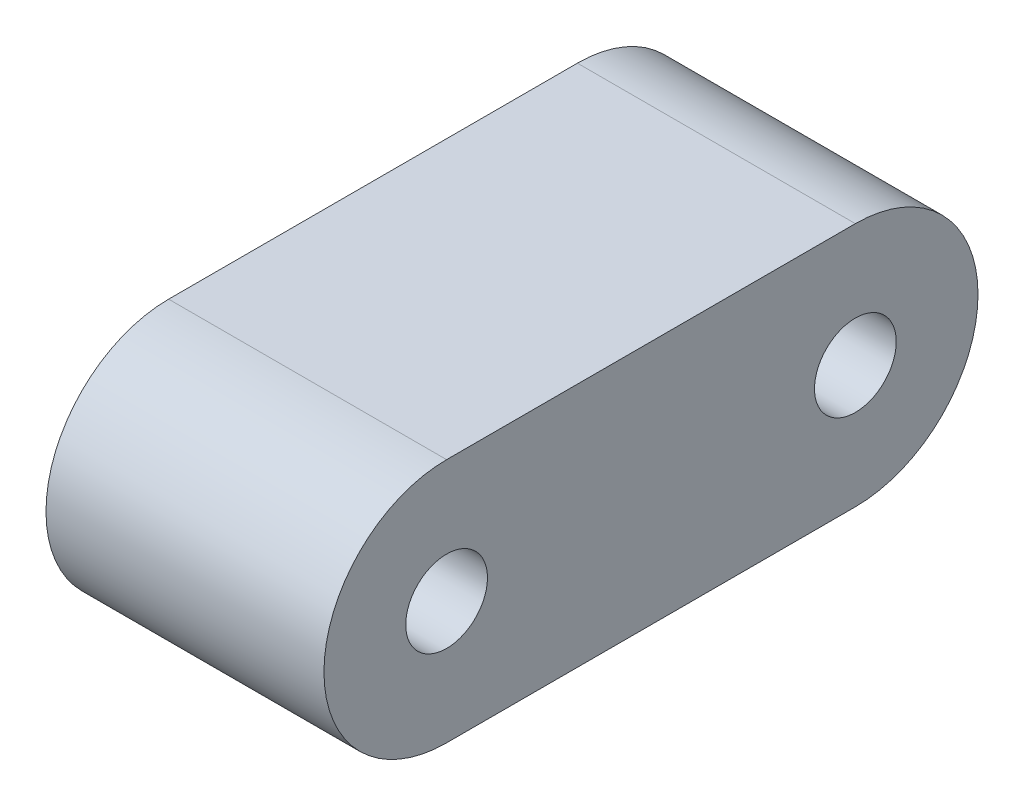
ISO-10303-21;
HEADER;
FILE_DESCRIPTION(('STEP AP214'),'2;1');
FILE_NAME('part.step','',(''),(''),'','','');
FILE_SCHEMA(('AUTOMOTIVE_DESIGN { 1 0 10303 214 1 1 1 1 }'));
ENDSEC;
DATA;
#1=APPLICATION_CONTEXT('core data for automotive mechanical design processes');
#2=APPLICATION_PROTOCOL_DEFINITION('international standard','automotive_design',2000,#1);
#3=PRODUCT_CONTEXT('',#1,'mechanical');
#4=PRODUCT('Part','Part','',(#3));
#5=PRODUCT_RELATED_PRODUCT_CATEGORY('part','',(#4));
#6=PRODUCT_DEFINITION_FORMATION('','',#4);
#7=PRODUCT_DEFINITION_CONTEXT('part definition',#1,'design');
#8=PRODUCT_DEFINITION('design','',#6,#7);
#9=PRODUCT_DEFINITION_SHAPE('','',#8);
#10=(LENGTH_UNIT() NAMED_UNIT(*) SI_UNIT(.MILLI.,.METRE.));
#11=(NAMED_UNIT(*) PLANE_ANGLE_UNIT() SI_UNIT($,.RADIAN.));
#12=(NAMED_UNIT(*) SI_UNIT($,.STERADIAN.) SOLID_ANGLE_UNIT());
#13=UNCERTAINTY_MEASURE_WITH_UNIT(LENGTH_MEASURE(1.E-05),#10,'distance_accuracy_value','');
#14=(GEOMETRIC_REPRESENTATION_CONTEXT(3) GLOBAL_UNCERTAINTY_ASSIGNED_CONTEXT((#13)) GLOBAL_UNIT_ASSIGNED_CONTEXT((#10,
#11,#12)) REPRESENTATION_CONTEXT('',''));
#15=CARTESIAN_POINT('',(0.,0.,0.));
#16=DIRECTION('',(0.,0.,1.));
#17=DIRECTION('',(1.,0.,0.));
#18=AXIS2_PLACEMENT_3D('',#15,#16,#17);
#19=CARTESIAN_POINT('',(8.5,0.,12.5));
#20=DIRECTION('',(1.,0.,0.));
#21=DIRECTION('',(0.,0.,-1.));
#22=AXIS2_PLACEMENT_3D('',#19,#20,#21);
#23=PLANE('',#22);
#24=CARTESIAN_POINT('',(8.5,0.,12.5));
#25=DIRECTION('',(1.,0.,0.));
#26=DIRECTION('',(0.,0.,-1.));
#27=AXIS2_PLACEMENT_3D('',#24,#25,#26);
#28=CIRCLE('',#27,2.5);
#29=CARTESIAN_POINT('',(8.5,0.,10.));
#30=VERTEX_POINT('',#29);
#31=EDGE_CURVE('E100',#30,#30,#28,.T.);
#32=ORIENTED_EDGE('',*,*,#31,.F.);
#33=EDGE_LOOP('',(#32));
#34=FACE_BOUND('',#33,.T.);
#35=CARTESIAN_POINT('',(8.5,0.,12.5));
#36=DIRECTION('',(1.,0.,0.));
#37=DIRECTION('',(0.,0.,-1.));
#38=AXIS2_PLACEMENT_3D('',#35,#36,#37);
#39=CIRCLE('',#38,7.49999999999999);
#40=CARTESIAN_POINT('',(8.5,7.49999999999999,12.5));
#41=VERTEX_POINT('',#40);
#42=CARTESIAN_POINT('',(8.5,-7.5,12.5));
#43=VERTEX_POINT('',#42);
#44=EDGE_CURVE('E85',#41,#43,#39,.T.);
#45=ORIENTED_EDGE('',*,*,#44,.T.);
#46=DIRECTION('',(0.,0.,-1.));
#47=VECTOR('',#46,1.);
#48=CARTESIAN_POINT('',(8.5,-7.5,12.5));
#49=LINE('',#48,#47);
#50=CARTESIAN_POINT('',(8.5,-7.49999999999999,-12.5));
#51=VERTEX_POINT('',#50);
#52=EDGE_CURVE('E80',#43,#51,#49,.T.);
#53=ORIENTED_EDGE('',*,*,#52,.T.);
#54=CARTESIAN_POINT('',(8.5,0.,-12.5));
#55=DIRECTION('',(1.,0.,0.));
#56=DIRECTION('',(0.,0.,-1.));
#57=AXIS2_PLACEMENT_3D('',#54,#55,#56);
#58=CIRCLE('',#57,7.49999999999999);
#59=CARTESIAN_POINT('',(8.5,7.49999999999999,-12.5));
#60=VERTEX_POINT('',#59);
#61=EDGE_CURVE('E83',#51,#60,#58,.T.);
#62=ORIENTED_EDGE('',*,*,#61,.T.);
#63=DIRECTION('',(0.,0.,1.));
#64=VECTOR('',#63,1.);
#65=CARTESIAN_POINT('',(8.5,7.49999999999999,12.5));
#66=LINE('',#65,#64);
#67=EDGE_CURVE('E50',#60,#41,#66,.T.);
#68=ORIENTED_EDGE('',*,*,#67,.T.);
#69=EDGE_LOOP('',(#45,#53,#62,#68));
#70=FACE_BOUND('',#69,.T.);
#71=CARTESIAN_POINT('',(8.5,0.,-12.5));
#72=DIRECTION('',(1.,0.,0.));
#73=DIRECTION('',(0.,0.,-1.));
#74=AXIS2_PLACEMENT_3D('',#71,#72,#73);
#75=CIRCLE('',#74,2.5);
#76=CARTESIAN_POINT('',(8.5,0.,-15.));
#77=VERTEX_POINT('',#76);
#78=EDGE_CURVE('E115',#77,#77,#75,.T.);
#79=ORIENTED_EDGE('',*,*,#78,.F.);
#80=EDGE_LOOP('',(#79));
#81=FACE_BOUND('',#80,.T.);
#82=ADVANCED_FACE('F33',(#34,#70,#81),#23,.T.);
#83=CARTESIAN_POINT('',(-8.5,0.,12.5));
#84=DIRECTION('',(1.,0.,0.));
#85=DIRECTION('',(0.,0.,-1.));
#86=AXIS2_PLACEMENT_3D('',#83,#84,#85);
#87=PLANE('',#86);
#88=CARTESIAN_POINT('',(-8.5,0.,12.5));
#89=DIRECTION('',(1.,0.,0.));
#90=DIRECTION('',(0.,0.,-1.));
#91=AXIS2_PLACEMENT_3D('',#88,#89,#90);
#92=CIRCLE('',#91,7.49999999999999);
#93=CARTESIAN_POINT('',(-8.5,7.49999999999999,12.5));
#94=VERTEX_POINT('',#93);
#95=CARTESIAN_POINT('',(-8.5,-7.5,12.5));
#96=VERTEX_POINT('',#95);
#97=EDGE_CURVE('E97',#94,#96,#92,.T.);
#98=ORIENTED_EDGE('',*,*,#97,.F.);
#99=DIRECTION('',(0.,0.,1.));
#100=VECTOR('',#99,1.);
#101=CARTESIAN_POINT('',(-8.5,7.49999999999999,12.5));
#102=LINE('',#101,#100);
#103=CARTESIAN_POINT('',(-8.5,7.49999999999999,-12.5));
#104=VERTEX_POINT('',#103);
#105=EDGE_CURVE('E73',#104,#94,#102,.T.);
#106=ORIENTED_EDGE('',*,*,#105,.F.);
#107=CARTESIAN_POINT('',(-8.5,0.,-12.5));
#108=DIRECTION('',(1.,0.,0.));
#109=DIRECTION('',(0.,0.,-1.));
#110=AXIS2_PLACEMENT_3D('',#107,#108,#109);
#111=CIRCLE('',#110,7.49999999999999);
#112=CARTESIAN_POINT('',(-8.5,-7.49999999999999,-12.5));
#113=VERTEX_POINT('',#112);
#114=EDGE_CURVE('E67',#113,#104,#111,.T.);
#115=ORIENTED_EDGE('',*,*,#114,.F.);
#116=DIRECTION('',(0.,0.,-1.));
#117=VECTOR('',#116,1.);
#118=CARTESIAN_POINT('',(-8.5,-7.5,12.5));
#119=LINE('',#118,#117);
#120=EDGE_CURVE('E89',#96,#113,#119,.T.);
#121=ORIENTED_EDGE('',*,*,#120,.F.);
#122=EDGE_LOOP('',(#98,#106,#115,#121));
#123=FACE_BOUND('',#122,.T.);
#124=CARTESIAN_POINT('',(-8.5,0.,12.5));
#125=DIRECTION('',(1.,0.,0.));
#126=DIRECTION('',(0.,0.,-1.));
#127=AXIS2_PLACEMENT_3D('',#124,#125,#126);
#128=CIRCLE('',#127,2.5);
#129=CARTESIAN_POINT('',(-8.5,0.,10.));
#130=VERTEX_POINT('',#129);
#131=EDGE_CURVE('E112',#130,#130,#128,.T.);
#132=ORIENTED_EDGE('',*,*,#131,.T.);
#133=EDGE_LOOP('',(#132));
#134=FACE_BOUND('',#133,.T.);
#135=CARTESIAN_POINT('',(-8.5,0.,-12.5));
#136=DIRECTION('',(1.,0.,0.));
#137=DIRECTION('',(0.,0.,-1.));
#138=AXIS2_PLACEMENT_3D('',#135,#136,#137);
#139=CIRCLE('',#138,2.5);
#140=CARTESIAN_POINT('',(-8.5,0.,-15.));
#141=VERTEX_POINT('',#140);
#142=EDGE_CURVE('E118',#141,#141,#139,.T.);
#143=ORIENTED_EDGE('',*,*,#142,.T.);
#144=EDGE_LOOP('',(#143));
#145=FACE_BOUND('',#144,.T.);
#146=ADVANCED_FACE('F108',(#123,#134,#145),#87,.F.);
#147=CARTESIAN_POINT('',(8.5,0.,12.5));
#148=DIRECTION('',(-1.,0.,0.));
#149=DIRECTION('',(0.,0.,1.));
#150=AXIS2_PLACEMENT_3D('',#147,#148,#149);
#151=CYLINDRICAL_SURFACE('',#150,7.49999999999999);
#152=ORIENTED_EDGE('',*,*,#97,.T.);
#153=DIRECTION('',(-1.,0.,0.));
#154=VECTOR('',#153,1.);
#155=CARTESIAN_POINT('',(8.5,-7.5,12.5));
#156=LINE('',#155,#154);
#157=EDGE_CURVE('E11',#43,#96,#156,.T.);
#158=ORIENTED_EDGE('',*,*,#157,.F.);
#159=ORIENTED_EDGE('',*,*,#44,.F.);
#160=DIRECTION('',(-1.,0.,0.));
#161=VECTOR('',#160,1.);
#162=CARTESIAN_POINT('',(8.5,7.49999999999999,12.5));
#163=LINE('',#162,#161);
#164=EDGE_CURVE('E93',#41,#94,#163,.T.);
#165=ORIENTED_EDGE('',*,*,#164,.T.);
#166=EDGE_LOOP('',(#152,#158,#159,#165));
#167=FACE_BOUND('',#166,.T.);
#168=ADVANCED_FACE('F35',(#167),#151,.T.);
#169=CARTESIAN_POINT('',(8.5,-7.5,12.5));
#170=DIRECTION('',(0.,1.,0.));
#171=DIRECTION('',(0.,0.,1.));
#172=AXIS2_PLACEMENT_3D('',#169,#170,#171);
#173=PLANE('',#172);
#174=ORIENTED_EDGE('',*,*,#120,.T.);
#175=DIRECTION('',(-1.,0.,0.));
#176=VECTOR('',#175,1.);
#177=CARTESIAN_POINT('',(8.5,-7.49999999999999,-12.5));
#178=LINE('',#177,#176);
#179=EDGE_CURVE('E42',#51,#113,#178,.T.);
#180=ORIENTED_EDGE('',*,*,#179,.F.);
#181=ORIENTED_EDGE('',*,*,#52,.F.);
#182=ORIENTED_EDGE('',*,*,#157,.T.);
#183=EDGE_LOOP('',(#174,#180,#181,#182));
#184=FACE_BOUND('',#183,.T.);
#185=ADVANCED_FACE('F88',(#184),#173,.F.);
#186=CARTESIAN_POINT('',(8.5,0.,-12.5));
#187=DIRECTION('',(-1.,0.,0.));
#188=DIRECTION('',(0.,0.,1.));
#189=AXIS2_PLACEMENT_3D('',#186,#187,#188);
#190=CYLINDRICAL_SURFACE('',#189,7.49999999999999);
#191=ORIENTED_EDGE('',*,*,#114,.T.);
#192=DIRECTION('',(-1.,0.,0.));
#193=VECTOR('',#192,1.);
#194=CARTESIAN_POINT('',(8.5,7.49999999999999,-12.5));
#195=LINE('',#194,#193);
#196=EDGE_CURVE('E90',#60,#104,#195,.T.);
#197=ORIENTED_EDGE('',*,*,#196,.F.);
#198=ORIENTED_EDGE('',*,*,#61,.F.);
#199=ORIENTED_EDGE('',*,*,#179,.T.);
#200=EDGE_LOOP('',(#191,#197,#198,#199));
#201=FACE_BOUND('',#200,.T.);
#202=ADVANCED_FACE('F91',(#201),#190,.T.);
#203=CARTESIAN_POINT('',(8.5,7.49999999999999,12.5));
#204=DIRECTION('',(0.,-1.,0.));
#205=DIRECTION('',(0.,0.,-1.));
#206=AXIS2_PLACEMENT_3D('',#203,#204,#205);
#207=PLANE('',#206);
#208=ORIENTED_EDGE('',*,*,#105,.T.);
#209=ORIENTED_EDGE('',*,*,#164,.F.);
#210=ORIENTED_EDGE('',*,*,#67,.F.);
#211=ORIENTED_EDGE('',*,*,#196,.T.);
#212=EDGE_LOOP('',(#208,#209,#210,#211));
#213=FACE_BOUND('',#212,.T.);
#214=ADVANCED_FACE('F105',(#213),#207,.F.);
#215=CARTESIAN_POINT('',(8.5,0.,12.5));
#216=DIRECTION('',(-1.,0.,0.));
#217=DIRECTION('',(0.,0.,1.));
#218=AXIS2_PLACEMENT_3D('',#215,#216,#217);
#219=CYLINDRICAL_SURFACE('',#218,2.5);
#220=ORIENTED_EDGE('',*,*,#31,.T.);
#221=EDGE_LOOP('',(#220));
#222=FACE_BOUND('',#221,.T.);
#223=ORIENTED_EDGE('',*,*,#131,.F.);
#224=EDGE_LOOP('',(#223));
#225=FACE_BOUND('',#224,.T.);
#226=ADVANCED_FACE('F135',(#222,#225),#219,.F.);
#227=CARTESIAN_POINT('',(8.5,0.,-12.5));
#228=DIRECTION('',(-1.,0.,0.));
#229=DIRECTION('',(0.,0.,1.));
#230=AXIS2_PLACEMENT_3D('',#227,#228,#229);
#231=CYLINDRICAL_SURFACE('',#230,2.5);
#232=ORIENTED_EDGE('',*,*,#78,.T.);
#233=EDGE_LOOP('',(#232));
#234=FACE_BOUND('',#233,.T.);
#235=ORIENTED_EDGE('',*,*,#142,.F.);
#236=EDGE_LOOP('',(#235));
#237=FACE_BOUND('',#236,.T.);
#238=ADVANCED_FACE('F124',(#234,#237),#231,.F.);
#239=CLOSED_SHELL('',(#82,#146,#168,#185,#202,#214,#226,#238));
#240=MANIFOLD_SOLID_BREP('B2',#239);
#241=ADVANCED_BREP_SHAPE_REPRESENTATION('',(#18,#240),#14);
#242=SHAPE_DEFINITION_REPRESENTATION(#9,#241);
ENDSEC;
END-ISO-10303-21;
